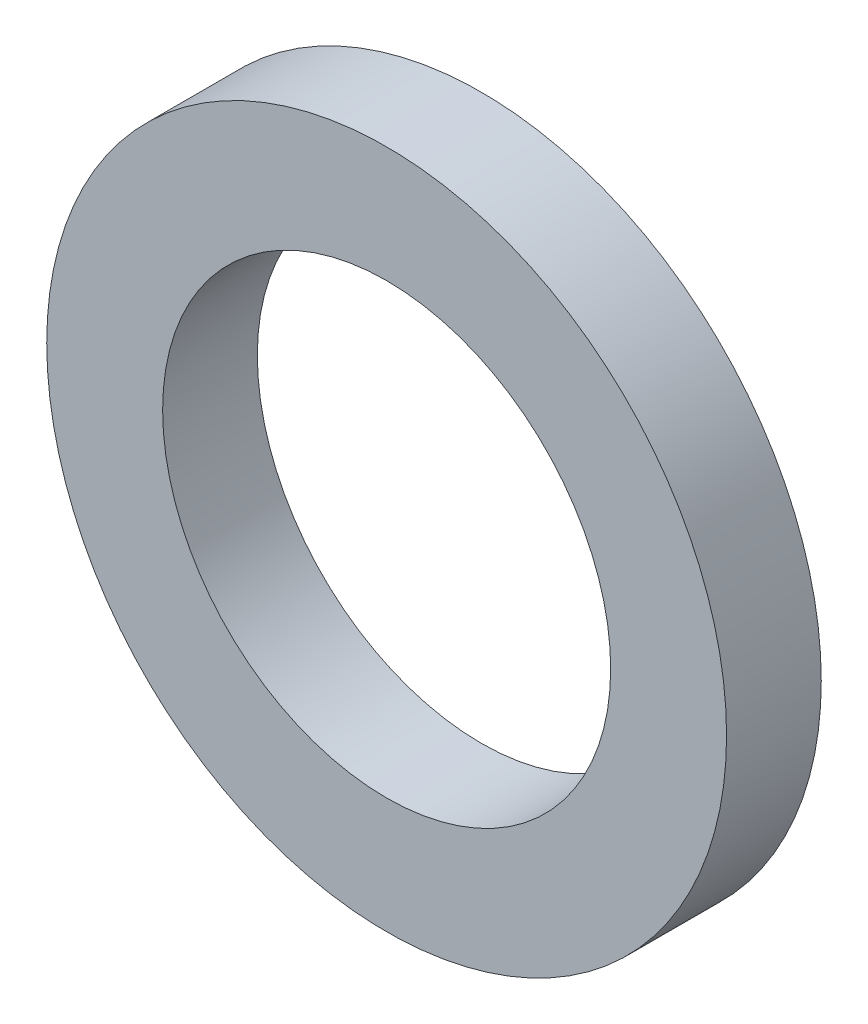
ISO-10303-21;
HEADER;
FILE_DESCRIPTION(('STEP AP214'),'2;1');
FILE_NAME('part.step','',(''),(''),'','','');
FILE_SCHEMA(('AUTOMOTIVE_DESIGN { 1 0 10303 214 1 1 1 1 }'));
ENDSEC;
DATA;
#1=APPLICATION_CONTEXT('core data for automotive mechanical design processes');
#2=APPLICATION_PROTOCOL_DEFINITION('international standard','automotive_design',2000,#1);
#3=PRODUCT_CONTEXT('',#1,'mechanical');
#4=PRODUCT('Part','Part','',(#3));
#5=PRODUCT_RELATED_PRODUCT_CATEGORY('part','',(#4));
#6=PRODUCT_DEFINITION_FORMATION('','',#4);
#7=PRODUCT_DEFINITION_CONTEXT('part definition',#1,'design');
#8=PRODUCT_DEFINITION('design','',#6,#7);
#9=PRODUCT_DEFINITION_SHAPE('','',#8);
#10=(LENGTH_UNIT() NAMED_UNIT(*) SI_UNIT(.MILLI.,.METRE.));
#11=(NAMED_UNIT(*) PLANE_ANGLE_UNIT() SI_UNIT($,.RADIAN.));
#12=(NAMED_UNIT(*) SI_UNIT($,.STERADIAN.) SOLID_ANGLE_UNIT());
#13=UNCERTAINTY_MEASURE_WITH_UNIT(LENGTH_MEASURE(1.E-05),#10,'distance_accuracy_value','');
#14=(GEOMETRIC_REPRESENTATION_CONTEXT(3) GLOBAL_UNCERTAINTY_ASSIGNED_CONTEXT((#13)) GLOBAL_UNIT_ASSIGNED_CONTEXT((#10,
#11,#12)) REPRESENTATION_CONTEXT('',''));
#15=CARTESIAN_POINT('',(0.,0.,0.));
#16=DIRECTION('',(0.,0.,1.));
#17=DIRECTION('',(1.,0.,0.));
#18=AXIS2_PLACEMENT_3D('',#15,#16,#17);
#19=CARTESIAN_POINT('',(0.,0.,-3.4036));
#20=DIRECTION('',(0.,0.,1.));
#21=DIRECTION('',(1.,0.,0.));
#22=AXIS2_PLACEMENT_3D('',#19,#20,#21);
#23=CYLINDRICAL_SURFACE('',#22,12.2174);
#24=CARTESIAN_POINT('',(0.,0.,-3.4036));
#25=DIRECTION('',(0.,0.,1.));
#26=DIRECTION('',(1.,0.,0.));
#27=AXIS2_PLACEMENT_3D('',#24,#25,#26);
#28=CIRCLE('',#27,12.2174);
#29=CARTESIAN_POINT('',(12.2174,0.,-3.4036));
#30=VERTEX_POINT('',#29);
#31=EDGE_CURVE('E10',#30,#30,#28,.T.);
#32=ORIENTED_EDGE('',*,*,#31,.T.);
#33=EDGE_LOOP('',(#32));
#34=FACE_BOUND('',#33,.T.);
#35=CARTESIAN_POINT('',(0.,0.,0.));
#36=DIRECTION('',(0.,0.,1.));
#37=DIRECTION('',(1.,0.,0.));
#38=AXIS2_PLACEMENT_3D('',#35,#36,#37);
#39=CIRCLE('',#38,12.2174);
#40=CARTESIAN_POINT('',(12.2174,0.,0.));
#41=VERTEX_POINT('',#40);
#42=EDGE_CURVE('E36',#41,#41,#39,.T.);
#43=ORIENTED_EDGE('',*,*,#42,.F.);
#44=EDGE_LOOP('',(#43));
#45=FACE_BOUND('',#44,.T.);
#46=ADVANCED_FACE('F33',(#34,#45),#23,.T.);
#47=CARTESIAN_POINT('',(0.,0.,-3.4036));
#48=DIRECTION('',(0.,0.,1.));
#49=DIRECTION('',(1.,0.,0.));
#50=AXIS2_PLACEMENT_3D('',#47,#48,#49);
#51=PLANE('',#50);
#52=CARTESIAN_POINT('',(0.,0.,-3.4036));
#53=DIRECTION('',(0.,0.,1.));
#54=DIRECTION('',(1.,0.,0.));
#55=AXIS2_PLACEMENT_3D('',#52,#53,#54);
#56=CIRCLE('',#55,8.0518);
#57=CARTESIAN_POINT('',(8.0518,0.,-3.4036));
#58=VERTEX_POINT('',#57);
#59=EDGE_CURVE('E43',#58,#58,#56,.T.);
#60=ORIENTED_EDGE('',*,*,#59,.T.);
#61=EDGE_LOOP('',(#60));
#62=FACE_BOUND('',#61,.T.);
#63=ORIENTED_EDGE('',*,*,#31,.F.);
#64=EDGE_LOOP('',(#63));
#65=FACE_BOUND('',#64,.T.);
#66=ADVANCED_FACE('F51',(#62,#65),#51,.F.);
#67=CARTESIAN_POINT('',(0.,0.,0.));
#68=DIRECTION('',(0.,0.,1.));
#69=DIRECTION('',(1.,0.,0.));
#70=AXIS2_PLACEMENT_3D('',#67,#68,#69);
#71=PLANE('',#70);
#72=CARTESIAN_POINT('',(0.,0.,0.));
#73=DIRECTION('',(0.,0.,1.));
#74=DIRECTION('',(1.,0.,0.));
#75=AXIS2_PLACEMENT_3D('',#72,#73,#74);
#76=CIRCLE('',#75,8.0518);
#77=CARTESIAN_POINT('',(8.0518,0.,0.));
#78=VERTEX_POINT('',#77);
#79=EDGE_CURVE('E45',#78,#78,#76,.T.);
#80=ORIENTED_EDGE('',*,*,#79,.F.);
#81=EDGE_LOOP('',(#80));
#82=FACE_BOUND('',#81,.T.);
#83=ORIENTED_EDGE('',*,*,#42,.T.);
#84=EDGE_LOOP('',(#83));
#85=FACE_BOUND('',#84,.T.);
#86=ADVANCED_FACE('F57',(#82,#85),#71,.T.);
#87=CARTESIAN_POINT('',(0.,0.,-3.4036));
#88=DIRECTION('',(0.,0.,1.));
#89=DIRECTION('',(1.,0.,0.));
#90=AXIS2_PLACEMENT_3D('',#87,#88,#89);
#91=CYLINDRICAL_SURFACE('',#90,8.0518);
#92=ORIENTED_EDGE('',*,*,#59,.F.);
#93=EDGE_LOOP('',(#92));
#94=FACE_BOUND('',#93,.T.);
#95=ORIENTED_EDGE('',*,*,#79,.T.);
#96=EDGE_LOOP('',(#95));
#97=FACE_BOUND('',#96,.T.);
#98=ADVANCED_FACE('F54',(#94,#97),#91,.F.);
#99=CLOSED_SHELL('',(#46,#66,#86,#98));
#100=MANIFOLD_SOLID_BREP('B2',#99);
#101=ADVANCED_BREP_SHAPE_REPRESENTATION('',(#18,#100),#14);
#102=SHAPE_DEFINITION_REPRESENTATION(#9,#101);
ENDSEC;
END-ISO-10303-21;
